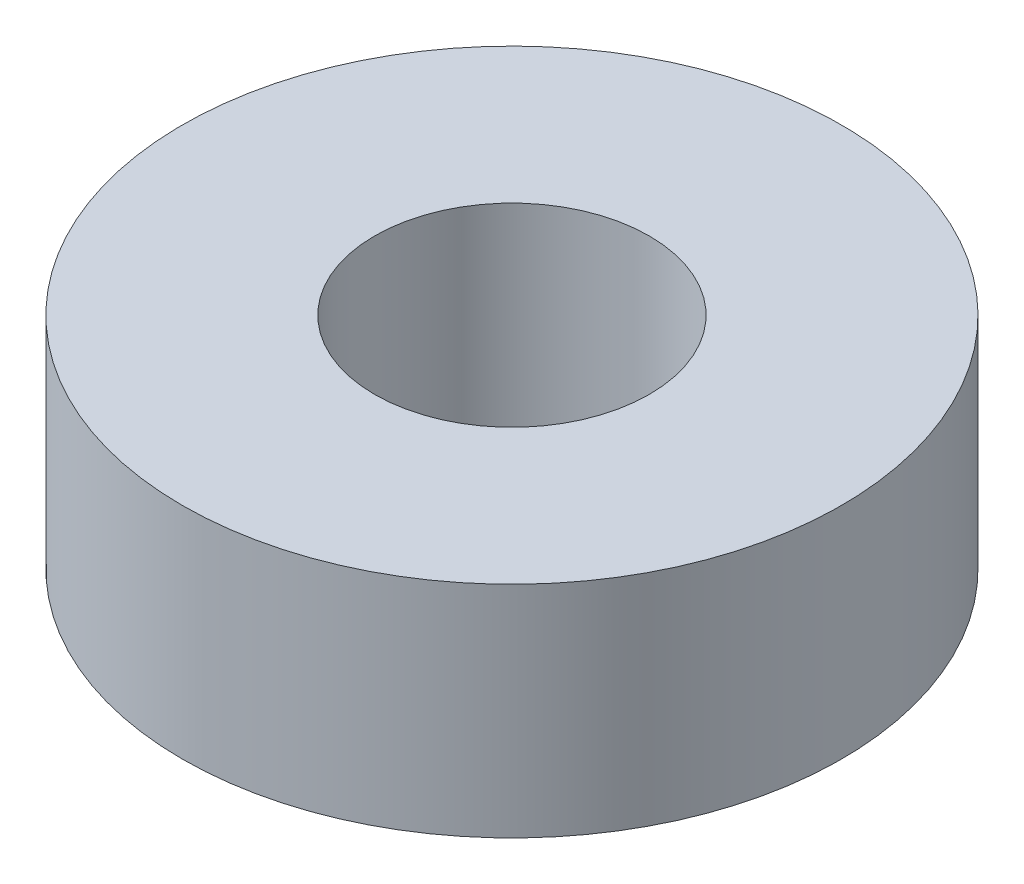
ISO-10303-21;
HEADER;
FILE_DESCRIPTION(('STEP AP214'),'2;1');
FILE_NAME('part.step','',(''),(''),'','','');
FILE_SCHEMA(('AUTOMOTIVE_DESIGN { 1 0 10303 214 1 1 1 1 }'));
ENDSEC;
DATA;
#1=APPLICATION_CONTEXT('core data for automotive mechanical design processes');
#2=APPLICATION_PROTOCOL_DEFINITION('international standard','automotive_design',2000,#1);
#3=PRODUCT_CONTEXT('',#1,'mechanical');
#4=PRODUCT('Part','Part','',(#3));
#5=PRODUCT_RELATED_PRODUCT_CATEGORY('part','',(#4));
#6=PRODUCT_DEFINITION_FORMATION('','',#4);
#7=PRODUCT_DEFINITION_CONTEXT('part definition',#1,'design');
#8=PRODUCT_DEFINITION('design','',#6,#7);
#9=PRODUCT_DEFINITION_SHAPE('','',#8);
#10=(LENGTH_UNIT() NAMED_UNIT(*) SI_UNIT(.MILLI.,.METRE.));
#11=(NAMED_UNIT(*) PLANE_ANGLE_UNIT() SI_UNIT($,.RADIAN.));
#12=(NAMED_UNIT(*) SI_UNIT($,.STERADIAN.) SOLID_ANGLE_UNIT());
#13=UNCERTAINTY_MEASURE_WITH_UNIT(LENGTH_MEASURE(1.E-05),#10,'distance_accuracy_value','');
#14=(GEOMETRIC_REPRESENTATION_CONTEXT(3) GLOBAL_UNCERTAINTY_ASSIGNED_CONTEXT((#13)) GLOBAL_UNIT_ASSIGNED_CONTEXT((#10,
#11,#12)) REPRESENTATION_CONTEXT('',''));
#15=CARTESIAN_POINT('',(0.,0.,0.));
#16=DIRECTION('',(0.,0.,1.));
#17=DIRECTION('',(1.,0.,0.));
#18=AXIS2_PLACEMENT_3D('',#15,#16,#17);
#19=CARTESIAN_POINT('',(0.,4.,0.));
#20=DIRECTION('',(0.,1.,0.));
#21=DIRECTION('',(0.,0.,1.));
#22=AXIS2_PLACEMENT_3D('',#19,#20,#21);
#23=PLANE('',#22);
#24=CARTESIAN_POINT('',(0.,4.,0.));
#25=DIRECTION('',(0.,1.,0.));
#26=DIRECTION('',(0.,0.,1.));
#27=AXIS2_PLACEMENT_3D('',#24,#25,#26);
#28=CIRCLE('',#27,6.);
#29=CARTESIAN_POINT('',(0.,4.,6.));
#30=VERTEX_POINT('',#29);
#31=EDGE_CURVE('E10',#30,#30,#28,.T.);
#32=ORIENTED_EDGE('',*,*,#31,.T.);
#33=EDGE_LOOP('',(#32));
#34=FACE_BOUND('',#33,.T.);
#35=CARTESIAN_POINT('',(0.,4.,0.));
#36=DIRECTION('',(0.,1.,0.));
#37=DIRECTION('',(0.,0.,1.));
#38=AXIS2_PLACEMENT_3D('',#35,#36,#37);
#39=CIRCLE('',#38,2.5);
#40=CARTESIAN_POINT('',(0.,4.,2.5));
#41=VERTEX_POINT('',#40);
#42=EDGE_CURVE('E45',#41,#41,#39,.T.);
#43=ORIENTED_EDGE('',*,*,#42,.F.);
#44=EDGE_LOOP('',(#43));
#45=FACE_BOUND('',#44,.T.);
#46=ADVANCED_FACE('F34',(#34,#45),#23,.T.);
#47=CARTESIAN_POINT('',(0.,0.,0.));
#48=DIRECTION('',(0.,1.,0.));
#49=DIRECTION('',(0.,0.,1.));
#50=AXIS2_PLACEMENT_3D('',#47,#48,#49);
#51=PLANE('',#50);
#52=CARTESIAN_POINT('',(0.,0.,0.));
#53=DIRECTION('',(0.,1.,0.));
#54=DIRECTION('',(0.,0.,1.));
#55=AXIS2_PLACEMENT_3D('',#52,#53,#54);
#56=CIRCLE('',#55,6.);
#57=CARTESIAN_POINT('',(0.,0.,6.));
#58=VERTEX_POINT('',#57);
#59=EDGE_CURVE('E38',#58,#58,#56,.T.);
#60=ORIENTED_EDGE('',*,*,#59,.F.);
#61=EDGE_LOOP('',(#60));
#62=FACE_BOUND('',#61,.T.);
#63=CARTESIAN_POINT('',(0.,0.,0.));
#64=DIRECTION('',(0.,1.,0.));
#65=DIRECTION('',(0.,0.,1.));
#66=AXIS2_PLACEMENT_3D('',#63,#64,#65);
#67=CIRCLE('',#66,2.5);
#68=CARTESIAN_POINT('',(0.,0.,2.5));
#69=VERTEX_POINT('',#68);
#70=EDGE_CURVE('E47',#69,#69,#67,.T.);
#71=ORIENTED_EDGE('',*,*,#70,.T.);
#72=EDGE_LOOP('',(#71));
#73=FACE_BOUND('',#72,.T.);
#74=ADVANCED_FACE('F57',(#62,#73),#51,.F.);
#75=CARTESIAN_POINT('',(0.,4.,0.));
#76=DIRECTION('',(0.,-1.,0.));
#77=DIRECTION('',(0.,0.,-1.));
#78=AXIS2_PLACEMENT_3D('',#75,#76,#77);
#79=CYLINDRICAL_SURFACE('',#78,6.);
#80=ORIENTED_EDGE('',*,*,#31,.F.);
#81=EDGE_LOOP('',(#80));
#82=FACE_BOUND('',#81,.T.);
#83=ORIENTED_EDGE('',*,*,#59,.T.);
#84=EDGE_LOOP('',(#83));
#85=FACE_BOUND('',#84,.T.);
#86=ADVANCED_FACE('F36',(#82,#85),#79,.T.);
#87=CARTESIAN_POINT('',(0.,4.,0.));
#88=DIRECTION('',(0.,-1.,0.));
#89=DIRECTION('',(0.,0.,-1.));
#90=AXIS2_PLACEMENT_3D('',#87,#88,#89);
#91=CYLINDRICAL_SURFACE('',#90,2.5);
#92=ORIENTED_EDGE('',*,*,#42,.T.);
#93=EDGE_LOOP('',(#92));
#94=FACE_BOUND('',#93,.T.);
#95=ORIENTED_EDGE('',*,*,#70,.F.);
#96=EDGE_LOOP('',(#95));
#97=FACE_BOUND('',#96,.T.);
#98=ADVANCED_FACE('F53',(#94,#97),#91,.F.);
#99=CLOSED_SHELL('',(#46,#74,#86,#98));
#100=MANIFOLD_SOLID_BREP('B2',#99);
#101=ADVANCED_BREP_SHAPE_REPRESENTATION('',(#18,#100),#14);
#102=SHAPE_DEFINITION_REPRESENTATION(#9,#101);
ENDSEC;
END-ISO-10303-21;
